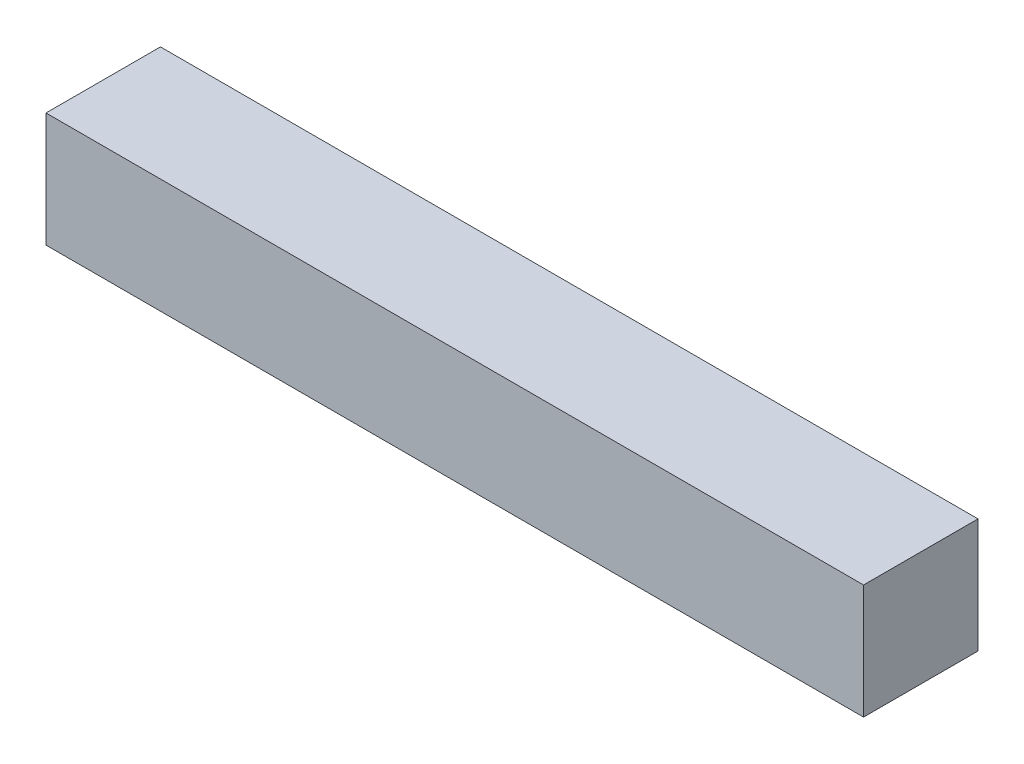
ISO-10303-21;
HEADER;
FILE_DESCRIPTION(('STEP AP214'),'2;1');
FILE_NAME('part.step','',(''),(''),'','','');
FILE_SCHEMA(('AUTOMOTIVE_DESIGN { 1 0 10303 214 1 1 1 1 }'));
ENDSEC;
DATA;
#1=APPLICATION_CONTEXT('core data for automotive mechanical design processes');
#2=APPLICATION_PROTOCOL_DEFINITION('international standard','automotive_design',2000,#1);
#3=PRODUCT_CONTEXT('',#1,'mechanical');
#4=PRODUCT('Part','Part','',(#3));
#5=PRODUCT_RELATED_PRODUCT_CATEGORY('part','',(#4));
#6=PRODUCT_DEFINITION_FORMATION('','',#4);
#7=PRODUCT_DEFINITION_CONTEXT('part definition',#1,'design');
#8=PRODUCT_DEFINITION('design','',#6,#7);
#9=PRODUCT_DEFINITION_SHAPE('','',#8);
#10=(LENGTH_UNIT() NAMED_UNIT(*) SI_UNIT(.MILLI.,.METRE.));
#11=(NAMED_UNIT(*) PLANE_ANGLE_UNIT() SI_UNIT($,.RADIAN.));
#12=(NAMED_UNIT(*) SI_UNIT($,.STERADIAN.) SOLID_ANGLE_UNIT());
#13=UNCERTAINTY_MEASURE_WITH_UNIT(LENGTH_MEASURE(1.E-05),#10,'distance_accuracy_value','');
#14=(GEOMETRIC_REPRESENTATION_CONTEXT(3) GLOBAL_UNCERTAINTY_ASSIGNED_CONTEXT((#13)) GLOBAL_UNIT_ASSIGNED_CONTEXT((#10,
#11,#12)) REPRESENTATION_CONTEXT('',''));
#15=CARTESIAN_POINT('',(0.,0.,0.));
#16=DIRECTION('',(0.,0.,1.));
#17=DIRECTION('',(1.,0.,0.));
#18=AXIS2_PLACEMENT_3D('',#15,#16,#17);
#19=CARTESIAN_POINT('',(-15000.,7000.,7000.));
#20=DIRECTION('',(1.,0.,0.));
#21=DIRECTION('',(0.,0.,-1.));
#22=AXIS2_PLACEMENT_3D('',#19,#20,#21);
#23=PLANE('',#22);
#24=DIRECTION('',(0.,-1.,0.));
#25=VECTOR('',#24,1.);
#26=CARTESIAN_POINT('',(-15000.,7000.,0.));
#27=LINE('',#26,#25);
#28=CARTESIAN_POINT('',(-15000.,7000.,0.));
#29=VERTEX_POINT('',#28);
#30=CARTESIAN_POINT('',(-15000.,0.,0.));
#31=VERTEX_POINT('',#30);
#32=EDGE_CURVE('E289',#29,#31,#27,.T.);
#33=ORIENTED_EDGE('',*,*,#32,.T.);
#34=DIRECTION('',(0.,0.,-1.));
#35=VECTOR('',#34,1.);
#36=CARTESIAN_POINT('',(-15000.,0.,7000.));
#37=LINE('',#36,#35);
#38=CARTESIAN_POINT('',(-15000.,0.,7000.));
#39=VERTEX_POINT('',#38);
#40=EDGE_CURVE('E362',#39,#31,#37,.T.);
#41=ORIENTED_EDGE('',*,*,#40,.F.);
#42=DIRECTION('',(0.,-1.,0.));
#43=VECTOR('',#42,1.);
#44=CARTESIAN_POINT('',(-15000.,7000.,7000.));
#45=LINE('',#44,#43);
#46=CARTESIAN_POINT('',(-15000.,7000.,7000.));
#47=VERTEX_POINT('',#46);
#48=EDGE_CURVE('E292',#47,#39,#45,.T.);
#49=ORIENTED_EDGE('',*,*,#48,.F.);
#50=DIRECTION('',(0.,0.,-1.));
#51=VECTOR('',#50,1.);
#52=CARTESIAN_POINT('',(-15000.,7000.,7000.));
#53=LINE('',#52,#51);
#54=EDGE_CURVE('E361',#47,#29,#53,.T.);
#55=ORIENTED_EDGE('',*,*,#54,.T.);
#56=EDGE_LOOP('',(#33,#41,#49,#55));
#57=FACE_BOUND('',#56,.T.);
#58=ADVANCED_FACE('F50',(#57),#23,.F.);
#59=CARTESIAN_POINT('',(-15000.,0.,7000.));
#60=DIRECTION('',(0.,1.,0.));
#61=DIRECTION('',(0.,0.,1.));
#62=AXIS2_PLACEMENT_3D('',#59,#60,#61);
#63=PLANE('',#62);
#64=DIRECTION('',(1.,0.,0.));
#65=VECTOR('',#64,1.);
#66=CARTESIAN_POINT('',(-15000.,0.,0.));
#67=LINE('',#66,#65);
#68=CARTESIAN_POINT('',(35000.,0.,0.));
#69=VERTEX_POINT('',#68);
#70=EDGE_CURVE('E364',#31,#69,#67,.T.);
#71=ORIENTED_EDGE('',*,*,#70,.T.);
#72=DIRECTION('',(0.,0.,-1.));
#73=VECTOR('',#72,1.);
#74=CARTESIAN_POINT('',(35000.,0.,7000.));
#75=LINE('',#74,#73);
#76=CARTESIAN_POINT('',(35000.,0.,7000.));
#77=VERTEX_POINT('',#76);
#78=EDGE_CURVE('E380',#77,#69,#75,.T.);
#79=ORIENTED_EDGE('',*,*,#78,.F.);
#80=DIRECTION('',(1.,0.,0.));
#81=VECTOR('',#80,1.);
#82=CARTESIAN_POINT('',(-15000.,0.,7000.));
#83=LINE('',#82,#81);
#84=EDGE_CURVE('E97',#39,#77,#83,.T.);
#85=ORIENTED_EDGE('',*,*,#84,.F.);
#86=ORIENTED_EDGE('',*,*,#40,.T.);
#87=EDGE_LOOP('',(#71,#79,#85,#86));
#88=FACE_BOUND('',#87,.T.);
#89=ADVANCED_FACE('F355',(#88),#63,.F.);
#90=CARTESIAN_POINT('',(35000.,0.,7000.));
#91=DIRECTION('',(-1.,0.,0.));
#92=DIRECTION('',(0.,0.,1.));
#93=AXIS2_PLACEMENT_3D('',#90,#91,#92);
#94=PLANE('',#93);
#95=DIRECTION('',(0.,1.,0.));
#96=VECTOR('',#95,1.);
#97=CARTESIAN_POINT('',(35000.,0.,0.));
#98=LINE('',#97,#96);
#99=CARTESIAN_POINT('',(35000.,7000.,0.));
#100=VERTEX_POINT('',#99);
#101=EDGE_CURVE('E370',#69,#100,#98,.T.);
#102=ORIENTED_EDGE('',*,*,#101,.T.);
#103=DIRECTION('',(0.,0.,-1.));
#104=VECTOR('',#103,1.);
#105=CARTESIAN_POINT('',(35000.,7000.,7000.));
#106=LINE('',#105,#104);
#107=CARTESIAN_POINT('',(35000.,7000.,7000.));
#108=VERTEX_POINT('',#107);
#109=EDGE_CURVE('E374',#108,#100,#106,.T.);
#110=ORIENTED_EDGE('',*,*,#109,.F.);
#111=DIRECTION('',(0.,1.,0.));
#112=VECTOR('',#111,1.);
#113=CARTESIAN_POINT('',(35000.,0.,7000.));
#114=LINE('',#113,#112);
#115=EDGE_CURVE('E555',#77,#108,#114,.T.);
#116=ORIENTED_EDGE('',*,*,#115,.F.);
#117=ORIENTED_EDGE('',*,*,#78,.T.);
#118=EDGE_LOOP('',(#102,#110,#116,#117));
#119=FACE_BOUND('',#118,.T.);
#120=ADVANCED_FACE('F360',(#119),#94,.F.);
#121=CARTESIAN_POINT('',(35000.,7000.,7000.));
#122=DIRECTION('',(0.,-1.,0.));
#123=DIRECTION('',(0.,0.,-1.));
#124=AXIS2_PLACEMENT_3D('',#121,#122,#123);
#125=PLANE('',#124);
#126=DIRECTION('',(-1.,0.,0.));
#127=VECTOR('',#126,1.);
#128=CARTESIAN_POINT('',(35000.,7000.,0.));
#129=LINE('',#128,#127);
#130=EDGE_CURVE('E93',#100,#29,#129,.T.);
#131=ORIENTED_EDGE('',*,*,#130,.T.);
#132=ORIENTED_EDGE('',*,*,#54,.F.);
#133=DIRECTION('',(-1.,0.,0.));
#134=VECTOR('',#133,1.);
#135=CARTESIAN_POINT('',(35000.,7000.,7000.));
#136=LINE('',#135,#134);
#137=EDGE_CURVE('E69',#108,#47,#136,.T.);
#138=ORIENTED_EDGE('',*,*,#137,.F.);
#139=ORIENTED_EDGE('',*,*,#109,.T.);
#140=EDGE_LOOP('',(#131,#132,#138,#139));
#141=FACE_BOUND('',#140,.T.);
#142=ADVANCED_FACE('F518',(#141),#125,.F.);
#143=CARTESIAN_POINT('',(0.,0.,7000.));
#144=DIRECTION('',(0.,0.,1.));
#145=DIRECTION('',(1.,0.,0.));
#146=AXIS2_PLACEMENT_3D('',#143,#144,#145);
#147=PLANE('',#146);
#148=ORIENTED_EDGE('',*,*,#48,.T.);
#149=ORIENTED_EDGE('',*,*,#84,.T.);
#150=ORIENTED_EDGE('',*,*,#115,.T.);
#151=ORIENTED_EDGE('',*,*,#137,.T.);
#152=EDGE_LOOP('',(#148,#149,#150,#151));
#153=FACE_BOUND('',#152,.T.);
#154=ADVANCED_FACE('F506',(#153),#147,.T.);
#155=CARTESIAN_POINT('',(0.,0.,0.));
#156=DIRECTION('',(0.,0.,1.));
#157=DIRECTION('',(1.,0.,0.));
#158=AXIS2_PLACEMENT_3D('',#155,#156,#157);
#159=PLANE('',#158);
#160=CARTESIAN_POINT('',(2596.6885254335,3150.,0.));
#161=DIRECTION('',(0.,0.,1.));
#162=DIRECTION('',(1.,0.,0.));
#163=AXIS2_PLACEMENT_3D('',#160,#161,#162);
#164=CIRCLE('',#163,3000.);
#165=CARTESIAN_POINT('',(2596.68852543349,150.,0.));
#166=VERTEX_POINT('',#165);
#167=CARTESIAN_POINT('',(2805.95827763562,157.307872364204,0.));
#168=VERTEX_POINT('',#167);
#169=EDGE_CURVE('E397',#166,#168,#164,.T.);
#170=ORIENTED_EDGE('',*,*,#169,.T.);
#171=DIRECTION('',(0.997564042545266,0.0697565840673672,0.));
#172=VECTOR('',#171,1.);
#173=CARTESIAN_POINT('',(2.70721029502106,-38.7148493870236,0.));
#174=LINE('',#173,#172);
#175=CARTESIAN_POINT('',(4781.451,295.448,0.));
#176=VERTEX_POINT('',#175);
#177=EDGE_CURVE('E11',#168,#176,#174,.T.);
#178=ORIENTED_EDGE('',*,*,#177,.T.);
#179=DIRECTION('',(0.,-1.,0.));
#180=VECTOR('',#179,1.);
#181=CARTESIAN_POINT('',(4781.451,0.,0.));
#182=LINE('',#181,#180);
#183=CARTESIAN_POINT('',(4781.451,507.675,0.));
#184=VERTEX_POINT('',#183);
#185=EDGE_CURVE('E53',#184,#176,#182,.T.);
#186=ORIENTED_EDGE('',*,*,#185,.F.);
#187=DIRECTION('',(-0.990268064554139,0.139173130755187,0.));
#188=VECTOR('',#187,1.);
#189=CARTESIAN_POINT('',(162.579802991674,1156.81515512762,0.));
#190=LINE('',#189,#188);
#191=CARTESIAN_POINT('',(2839.9436073883,780.536129108276,0.));
#192=VERTEX_POINT('',#191);
#193=EDGE_CURVE('E404',#184,#192,#190,.T.);
#194=ORIENTED_EDGE('',*,*,#193,.T.);
#195=CARTESIAN_POINT('',(2561.59734587792,-1200.,0.));
#196=DIRECTION('',(0.,0.,1.));
#197=DIRECTION('',(1.,0.,0.));
#198=AXIS2_PLACEMENT_3D('',#195,#196,#197);
#199=CIRCLE('',#198,2000.);
#200=CARTESIAN_POINT('',(2561.59734587791,800.,0.));
#201=VERTEX_POINT('',#200);
#202=EDGE_CURVE('E405',#192,#201,#199,.T.);
#203=ORIENTED_EDGE('',*,*,#202,.T.);
#204=DIRECTION('',(1.,0.,0.));
#205=VECTOR('',#204,1.);
#206=CARTESIAN_POINT('',(0.,800.,0.));
#207=LINE('',#206,#205);
#208=CARTESIAN_POINT('',(1524.43296743589,800.,0.));
#209=VERTEX_POINT('',#208);
#210=EDGE_CURVE('E215',#209,#201,#207,.T.);
#211=ORIENTED_EDGE('',*,*,#210,.F.);
#212=CARTESIAN_POINT('',(1524.43296743588,-200.,0.));
#213=DIRECTION('',(0.,0.,1.));
#214=DIRECTION('',(1.,0.,0.));
#215=AXIS2_PLACEMENT_3D('',#212,#213,#214);
#216=CIRCLE('',#215,1000.);
#217=CARTESIAN_POINT('',(1282.13370336686,770.201559796526,0.));
#218=VERTEX_POINT('',#217);
#219=EDGE_CURVE('E381',#209,#218,#216,.T.);
#220=ORIENTED_EDGE('',*,*,#219,.T.);
#221=DIRECTION('',(-0.970201559796527,-0.242299264069014,0.));
#222=VECTOR('',#221,1.);
#223=CARTESIAN_POINT('',(-105.785605771789,423.580979984227,0.));
#224=LINE('',#223,#222);
#225=CARTESIAN_POINT('',(113.655110389649,478.384359236518,0.));
#226=VERTEX_POINT('',#225);
#227=EDGE_CURVE('E383',#218,#226,#224,.T.);
#228=ORIENTED_EDGE('',*,*,#227,.T.);
#229=CARTESIAN_POINT('',(150.,332.854125267039,0.));
#230=DIRECTION('',(0.,0.,1.));
#231=DIRECTION('',(1.,0.,0.));
#232=AXIS2_PLACEMENT_3D('',#229,#230,#231);
#233=CIRCLE('',#232,150.);
#234=CARTESIAN_POINT('',(88.915850741552,469.853127852355,0.));
#235=VERTEX_POINT('',#234);
#236=EDGE_CURVE('E390',#226,#235,#233,.T.);
#237=ORIENTED_EDGE('',*,*,#236,.T.);
#238=DIRECTION('',(0.,-1.,0.));
#239=VECTOR('',#238,1.);
#240=CARTESIAN_POINT('',(88.915850741552,800.,0.));
#241=LINE('',#240,#239);
#242=CARTESIAN_POINT('',(88.915850741552,163.000997414683,0.));
#243=VERTEX_POINT('',#242);
#244=EDGE_CURVE('E392',#243,#235,#241,.F.);
#245=ORIENTED_EDGE('',*,*,#244,.F.);
#246=CARTESIAN_POINT('',(150.,300.,0.));
#247=DIRECTION('',(0.,0.,1.));
#248=DIRECTION('',(1.,0.,0.));
#249=AXIS2_PLACEMENT_3D('',#246,#247,#248);
#250=CIRCLE('',#249,150.);
#251=CARTESIAN_POINT('',(150.,150.,0.));
#252=VERTEX_POINT('',#251);
#253=EDGE_CURVE('E394',#243,#252,#250,.T.);
#254=ORIENTED_EDGE('',*,*,#253,.T.);
#255=DIRECTION('',(1.,0.,0.));
#256=VECTOR('',#255,1.);
#257=CARTESIAN_POINT('',(0.,150.,0.));
#258=LINE('',#257,#256);
#259=EDGE_CURVE('E398',#252,#166,#258,.T.);
#260=ORIENTED_EDGE('',*,*,#259,.T.);
#261=EDGE_LOOP('',(#170,#178,#186,#194,#203,#211,#220,#228,#237,#245,#254,#260));
#262=FACE_BOUND('',#261,.T.);
#263=ORIENTED_EDGE('',*,*,#32,.F.);
#264=ORIENTED_EDGE('',*,*,#130,.F.);
#265=ORIENTED_EDGE('',*,*,#101,.F.);
#266=ORIENTED_EDGE('',*,*,#70,.F.);
#267=EDGE_LOOP('',(#263,#264,#265,#266));
#268=FACE_BOUND('',#267,.T.);
#269=ADVANCED_FACE('F425',(#262,#268),#159,.F.);
#270=CARTESIAN_POINT('',(4781.451,800.,-433.24));
#271=DIRECTION('',(-1.,0.,0.));
#272=DIRECTION('',(0.,0.,1.));
#273=AXIS2_PLACEMENT_3D('',#270,#271,#272);
#274=PLANE('',#273);
#275=ORIENTED_EDGE('',*,*,#185,.T.);
#276=DIRECTION('',(0.,0.,1.));
#277=VECTOR('',#276,1.);
#278=CARTESIAN_POINT('',(4781.451,295.448,-800.));
#279=LINE('',#278,#277);
#280=CARTESIAN_POINT('',(4781.451,295.448,433.24));
#281=VERTEX_POINT('',#280);
#282=EDGE_CURVE('E415',#176,#281,#279,.T.);
#283=ORIENTED_EDGE('',*,*,#282,.T.);
#284=DIRECTION('',(0.,-1.,0.));
#285=VECTOR('',#284,1.);
#286=CARTESIAN_POINT('',(4781.451,800.,433.24));
#287=LINE('',#286,#285);
#288=CARTESIAN_POINT('',(4781.451,507.675,433.24));
#289=VERTEX_POINT('',#288);
#290=EDGE_CURVE('E235',#289,#281,#287,.T.);
#291=ORIENTED_EDGE('',*,*,#290,.F.);
#292=DIRECTION('',(0.,0.,1.));
#293=VECTOR('',#292,1.);
#294=CARTESIAN_POINT('',(4781.451,507.675,-800.));
#295=LINE('',#294,#293);
#296=EDGE_CURVE('E412',#184,#289,#295,.T.);
#297=ORIENTED_EDGE('',*,*,#296,.F.);
#298=EDGE_LOOP('',(#275,#283,#291,#297));
#299=FACE_BOUND('',#298,.T.);
#300=ADVANCED_FACE('F408',(#299),#274,.T.);
#301=CARTESIAN_POINT('',(248.915850741552,800.,0.));
#302=DIRECTION('',(0.,-1.,0.));
#303=DIRECTION('',(0.,0.,-1.));
#304=AXIS2_PLACEMENT_3D('',#301,#302,#303);
#305=CYLINDRICAL_SURFACE('',#304,160.);
#306=ORIENTED_EDGE('',*,*,#244,.T.);
#307=CARTESIAN_POINT('',(113.655110389649,478.384359236518,-85.4665555609618));
#308=CARTESIAN_POINT('',(112.481548775141,478.091251246447,-83.6092670561845));
#309=CARTESIAN_POINT('',(111.346644097831,477.792758019416,-81.7284269553966));
#310=CARTESIAN_POINT('',(109.155539322376,477.190616158341,-77.9222492442464));
#311=CARTESIAN_POINT('',(108.099339287709,476.886967520139,-75.9969115979976));
#312=CARTESIAN_POINT('',(106.066726798449,476.28003794887,-72.1037544888214));
#313=CARTESIAN_POINT('',(105.090338751608,475.976757156024,-70.1359222612503));
#314=CARTESIAN_POINT('',(103.219078804833,475.376092646382,-66.1609856636512));
#315=CARTESIAN_POINT('',(102.324206889226,475.078708928454,-64.1538813011744));
#316=CARTESIAN_POINT('',(100.615155376205,474.494355571979,-60.0979126598209));
#317=CARTESIAN_POINT('',(99.8011893520995,474.207414701507,-58.0489542101899));
#318=CARTESIAN_POINT('',(98.2579649310513,473.649846063953,-53.9172011460308));
#319=CARTESIAN_POINT('',(97.5287058529187,473.379218165696,-51.8344068037553));
#320=CARTESIAN_POINT('',(96.1563301521992,472.859117084361,-47.6382320407094));
#321=CARTESIAN_POINT('',(95.5132051875328,472.60964185351,-45.5248546039078));
#322=CARTESIAN_POINT('',(94.3143584712709,472.136301959897,-41.2706008249891));
#323=CARTESIAN_POINT('',(93.7586366886521,471.912437288045,-39.129724492633));
#324=CARTESIAN_POINT('',(92.734201058544,471.493714068683,-34.8169588640611));
#325=CARTESIAN_POINT('',(92.2657777763377,471.298952800951,-32.6449910275406));
#326=CARTESIAN_POINT('',(91.4193769647117,470.942942652504,-28.2807602607468));
#327=CARTESIAN_POINT('',(91.0413994536701,470.781693778598,-26.0884973263497));
#328=CARTESIAN_POINT('',(90.3769099830872,470.495754350508,-21.6877031685099));
#329=CARTESIAN_POINT('',(90.0904006314539,470.3710648387,-19.4791714830548));
#330=CARTESIAN_POINT('',(89.6096920384309,470.160642293218,-15.0502286552799));
#331=CARTESIAN_POINT('',(89.4154925954417,470.074909174466,-12.8298175389147));
#332=CARTESIAN_POINT('',(89.1202871703629,469.944192772485,-8.38608203623215));
#333=CARTESIAN_POINT('',(89.0190950709365,469.89912811075,-6.16277242290111));
#334=CARTESIAN_POINT('',(88.9095494355952,469.85033130989,-1.7134028572591));
#335=CARTESIAN_POINT('',(88.9011961796687,469.84659929542,0.512657103326271));
#336=CARTESIAN_POINT('',(88.9773519842946,469.88053927644,4.96271330927351));
#337=CARTESIAN_POINT('',(89.0618546528502,469.918208421966,7.18670968614089));
#338=CARTESIAN_POINT('',(89.3234496791945,470.03421396927,11.6281606883902));
#339=CARTESIAN_POINT('',(89.5005408160219,470.112549834776,13.8456153996491));
#340=CARTESIAN_POINT('',(89.9321621045493,470.301956853117,18.1246654421955));
#341=CARTESIAN_POINT('',(90.180864494467,470.410549583801,20.1869618215955));
#342=CARTESIAN_POINT('',(90.7580231251843,470.660101286196,24.2983674646402));
#343=CARTESIAN_POINT('',(91.0864784483613,470.80105988551,26.3474768797332));
#344=CARTESIAN_POINT('',(91.8223683487925,471.113023031167,30.4292401482985));
#345=CARTESIAN_POINT('',(92.2298065529467,471.284028957252,32.4618932416281));
#346=CARTESIAN_POINT('',(93.1227318674805,471.653295725565,36.5074669964445));
#347=CARTESIAN_POINT('',(93.6082188789857,471.851556533266,38.5203876829254));
#348=CARTESIAN_POINT('',(94.6565718524244,472.272288049974,42.5248328398245));
#349=CARTESIAN_POINT('',(95.2194884903989,472.494774594172,44.5163423691311));
#350=CARTESIAN_POINT('',(96.4213890293698,472.960326816393,48.4738685170571));
#351=CARTESIAN_POINT('',(97.0603744864908,473.203392915377,50.4398846132499));
#352=CARTESIAN_POINT('',(98.4131156544516,473.706224503163,54.3432821371033));
#353=CARTESIAN_POINT('',(99.1268525408052,473.965985781319,56.2806706344256));
#354=CARTESIAN_POINT('',(100.628038160787,474.498198486723,60.1247195944822));
#355=CARTESIAN_POINT('',(101.415481149761,474.770648924148,62.0313824384198));
#356=CARTESIAN_POINT('',(103.053431404472,475.32081390248,65.789878090736));
#357=CARTESIAN_POINT('',(103.903101089785,475.598430707961,67.6420903769369));
#358=CARTESIAN_POINT('',(105.67209476984,476.157638898924,71.3118119286049));
#359=CARTESIAN_POINT('',(106.591403065114,476.439229376993,73.1293289008586));
#360=CARTESIAN_POINT('',(108.495734917951,477.001198489011,76.7223038998116));
#361=CARTESIAN_POINT('',(109.480541740212,477.281578141369,78.4978766389943));
#362=CARTESIAN_POINT('',(111.517572665777,477.837629462675,82.0112043076934));
#363=CARTESIAN_POINT('',(112.569811610849,478.11330007814,83.7489507981427));
#364=CARTESIAN_POINT('',(113.655110389649,478.384359236518,85.4665555609618));
#365=B_SPLINE_CURVE_WITH_KNOTS('',3,(#307,#308,#309,#310,#311,#312,#313,#314,#315,#316,#317,
#318,#319,#320,#321,#322,#323,#324,#325,#326,#327,#328,#329,#330,#331,#332,#333,#334,#335,#336,
#337,#338,#339,#340,#341,#342,#343,#344,#345,#346,#347,#348,#349,#350,#351,#352,#353,#354,#355,
#356,#357,#358,#359,#360,#361,#362,#363,#364),.UNSPECIFIED.,.F.,.F.,(4,2,2,2,2,2,2,2,2,2,2,2,2,
2,2,2,2,2,2,2,2,2,2,2,2,2,2,2,4),(0.,6.64887428778499,13.2977539379704,19.948659370851,
26.5995635249058,33.2675826096337,39.9355480683043,46.602867267515,53.2701841001858,
59.9593109336103,66.6484391262357,73.3377580199061,80.0270623044362,86.7029512669012,
93.3788603628692,100.054309932788,106.729671475984,112.96807935669,119.206415462809,
125.445038101686,131.683652837372,137.926370215055,144.169215320706,150.41049206757,
156.651282773596,162.819674438677,168.986679604275,175.134206067186,181.283090275135),.UNSPECIFIED.);
#366=CARTESIAN_POINT('',(113.655110389649,478.384359236518,85.4665555609617));
#367=VERTEX_POINT('',#366);
#368=EDGE_CURVE('E284',#235,#367,#365,.T.);
#369=ORIENTED_EDGE('',*,*,#368,.T.);
#370=CARTESIAN_POINT('',(248.915850741552,512.164533586649,0.));
#371=DIRECTION('',(-0.242299264069014,0.970201559796527,0.));
#372=DIRECTION('',(-0.970201559796527,-0.242299264069014,0.));
#373=AXIS2_PLACEMENT_3D('',#370,#371,#372);
#374=ELLIPSE('',#373,164.914185495182,160.);
#375=CARTESIAN_POINT('',(146.069849075792,486.479653713564,122.567124227366));
#376=VERTEX_POINT('',#375);
#377=EDGE_CURVE('E239',#367,#376,#374,.T.);
#378=ORIENTED_EDGE('',*,*,#377,.T.);
#379=DIRECTION('',(0.,-1.,0.));
#380=VECTOR('',#379,1.);
#381=CARTESIAN_POINT('',(146.069849075792,800.,122.567124227366));
#382=LINE('',#381,#380);
#383=CARTESIAN_POINT('',(146.069849075792,150.05149579368,122.567124227366));
#384=VERTEX_POINT('',#383);
#385=EDGE_CURVE('E264',#376,#384,#382,.T.);
#386=ORIENTED_EDGE('',*,*,#385,.T.);
#387=CARTESIAN_POINT('',(146.069849075792,150.05149579368,122.567124227366));
#388=CARTESIAN_POINT('',(145.225896187737,150.073615862986,121.858965274647));
#389=CARTESIAN_POINT('',(144.389403735078,150.10267037739,121.142208725448));
#390=CARTESIAN_POINT('',(142.731732562761,150.173898990735,119.691878810571));
#391=CARTESIAN_POINT('',(141.910553439385,150.216072743283,118.958305889376));
#392=CARTESIAN_POINT('',(139.470868366272,150.361129926342,116.733201024686));
#393=CARTESIAN_POINT('',(137.875841570126,150.482559716361,115.21696983069));
#394=CARTESIAN_POINT('',(134.753163894521,150.768668470949,112.123624232258));
#395=CARTESIAN_POINT('',(133.225451311803,150.93330682306,110.546568179288));
#396=CARTESIAN_POINT('',(130.238183443832,151.299848120688,107.333236526025));
#397=CARTESIAN_POINT('',(128.778630993244,151.501752614314,105.696958467806));
#398=CARTESIAN_POINT('',(125.931676935866,151.936544202405,102.370309508307));
#399=CARTESIAN_POINT('',(124.544189466091,152.169393192373,100.680007045348));
#400=CARTESIAN_POINT('',(121.841191805207,152.660363289409,97.2461106147451));
#401=CARTESIAN_POINT('',(120.525688743644,152.918486892713,95.5025113949941));
#402=CARTESIAN_POINT('',(117.968237374469,153.454193404723,91.964601104587));
#403=CARTESIAN_POINT('',(116.726302922445,153.731779957634,90.170280574709));
#404=CARTESIAN_POINT('',(114.317781697973,154.30061613028,86.5339001588783));
#405=CARTESIAN_POINT('',(113.151194562145,154.591865684108,84.6918405032186));
#406=CARTESIAN_POINT('',(110.897824733608,155.181587391354,80.9675780900093));
#407=CARTESIAN_POINT('',(109.810835528921,155.480037975042,79.0854968370817));
#408=CARTESIAN_POINT('',(107.714650290854,156.079405738675,75.2790893235231));
#409=CARTESIAN_POINT('',(106.705447961739,156.380322716814,73.3547664979749));
#410=CARTESIAN_POINT('',(104.766102256039,156.979286585441,69.4663235668635));
#411=CARTESIAN_POINT('',(103.835956381895,157.277333566333,67.5022047209694));
#412=CARTESIAN_POINT('',(102.056014725659,157.865370760941,63.5366972442528));
#413=CARTESIAN_POINT('',(101.206218978074,158.155360971196,61.5353085974242));
#414=CARTESIAN_POINT('',(99.5883438109571,158.722260492992,57.4980406642496));
#415=CARTESIAN_POINT('',(98.8202607704063,158.999170383872,55.4621629108929));
#416=CARTESIAN_POINT('',(97.3670981874398,159.535137994833,51.3586713046533));
#417=CARTESIAN_POINT('',(96.6820184537681,159.794195756048,49.2910575249088));
#418=CARTESIAN_POINT('',(95.3961544075052,160.289961127426,45.1270537425637));
#419=CARTESIAN_POINT('',(94.7953724399696,160.526668115759,43.0306629412036));
#420=CARTESIAN_POINT('',(93.6793946591402,160.973560921307,38.8124012031521));
#421=CARTESIAN_POINT('',(93.1641993485658,161.183746582739,36.6905301168728));
#422=CARTESIAN_POINT('',(92.2054815596859,161.580090147205,32.356487055965));
#423=CARTESIAN_POINT('',(91.7647823485292,161.765263152301,30.1435991960532));
#424=CARTESIAN_POINT('',(90.9769971450889,162.099788455264,25.6985091153241));
#425=CARTESIAN_POINT('',(90.6299116592006,162.249140559359,23.4663067900942));
#426=CARTESIAN_POINT('',(90.0303510649592,162.509098243442,18.9869432101127));
#427=CARTESIAN_POINT('',(89.777877113808,162.61970334951,16.739781772737));
#428=CARTESIAN_POINT('',(89.3683152411961,162.799967461146,12.2351431066173));
#429=CARTESIAN_POINT('',(89.2112269898517,162.869626608322,9.97766591357682));
#430=CARTESIAN_POINT('',(88.9929975399224,162.966573670469,5.45852462440302));
#431=CARTESIAN_POINT('',(88.931798748024,162.993887019151,3.1968638589837));
#432=CARTESIAN_POINT('',(88.9053650594043,163.005672372788,-1.32714256143511));
#433=CARTESIAN_POINT('',(88.9401306105545,162.990144177799,-3.58948821958177));
#434=CARTESIAN_POINT('',(89.1055089639775,162.916561534982,-8.10985402745365));
#435=CARTESIAN_POINT('',(89.2361168008861,162.858509290226,-10.3678743951861));
#436=CARTESIAN_POINT('',(89.5927585147658,162.701044450916,-14.87488490689));
#437=CARTESIAN_POINT('',(89.8187908128023,162.601632540717,-17.1238751996554));
#438=CARTESIAN_POINT('',(90.3429801812063,162.37327852936,-21.4228503778689));
#439=CARTESIAN_POINT('',(90.6336330597826,162.247455783682,-23.4739216594459));
#440=CARTESIAN_POINT('',(91.2939301473005,161.964764084953,-27.561119440647));
#441=CARTESIAN_POINT('',(91.6635730265225,161.80789565453,-29.597246191251));
#442=CARTESIAN_POINT('',(92.4809730975262,161.465680222719,-33.6512206894353));
#443=CARTESIAN_POINT('',(92.9287263920883,161.280334642216,-35.6690693436968));
#444=CARTESIAN_POINT('',(93.9013954038357,160.884140870222,-39.6835512615572));
#445=CARTESIAN_POINT('',(94.4263115671196,160.673292531293,-41.680184402432));
#446=CARTESIAN_POINT('',(95.552956526948,160.229164392324,-45.6518215466958));
#447=CARTESIAN_POINT('',(96.1547795676428,159.995857158458,-47.6267957290531));
#448=CARTESIAN_POINT('',(97.433630910992,159.51069618808,-51.5499146356778));
#449=CARTESIAN_POINT('',(98.1106590220711,159.258842498813,-53.4980594282756));
#450=CARTESIAN_POINT('',(99.538782262935,158.74051365247,-57.3649671512542));
#451=CARTESIAN_POINT('',(100.289875495452,158.474038870009,-59.2837308328139));
#452=CARTESIAN_POINT('',(101.865082458927,157.930566690855,-63.0897276306053));
#453=CARTESIAN_POINT('',(102.689202935477,157.653568323443,-64.9769578148825));
#454=CARTESIAN_POINT('',(104.456303458341,157.078057225516,-68.819711214547));
#455=CARTESIAN_POINT('',(105.403318300004,156.779196163741,-70.7733280095368));
#456=CARTESIAN_POINT('',(107.376037897786,156.179762703235,-74.6404280365021));
#457=CARTESIAN_POINT('',(108.401751633397,155.879190112854,-76.5539066569258));
#458=CARTESIAN_POINT('',(110.530581696098,155.281696502486,-80.3382296775498));
#459=CARTESIAN_POINT('',(111.633707914142,154.984775954837,-82.2090685890931));
#460=CARTESIAN_POINT('',(113.915877050779,154.400125158147,-85.9053240855944));
#461=CARTESIAN_POINT('',(115.094919561143,154.112394859699,-87.7307409147313));
#462=CARTESIAN_POINT('',(117.524840972472,153.55234668348,-91.3296578351682));
#463=CARTESIAN_POINT('',(118.775557206226,153.279996489343,-93.1032626927824));
#464=CARTESIAN_POINT('',(121.349511124312,152.755732624533,-96.599903409527));
#465=CARTESIAN_POINT('',(122.672741392116,152.503816870396,-98.3229444126078));
#466=CARTESIAN_POINT('',(125.389551045749,152.026261589838,-101.715157723088));
#467=CARTESIAN_POINT('',(126.783099172462,151.800610532677,-103.384353435242));
#468=CARTESIAN_POINT('',(129.639032745831,151.381314860076,-106.666639713441));
#469=CARTESIAN_POINT('',(131.101408518524,151.187665763808,-108.279738109067));
#470=CARTESIAN_POINT('',(133.655821740112,150.889289293303,-110.984248112761));
#471=CARTESIAN_POINT('',(134.731225491401,150.775112297827,-112.090379610977));
#472=CARTESIAN_POINT('',(136.914396270225,150.567844867437,-114.271846346382));
#473=CARTESIAN_POINT('',(138.022156519602,150.474750051413,-115.347187941403));
#474=CARTESIAN_POINT('',(140.268778276439,150.311753447705,-117.465723562963));
#475=CARTESIAN_POINT('',(141.407626285841,150.241841762145,-118.508931135887));
#476=CARTESIAN_POINT('',(143.716040656992,150.127227399585,-120.562798775275));
#477=CARTESIAN_POINT('',(144.885614606153,150.082531011623,-121.573450662694));
#478=CARTESIAN_POINT('',(146.069849075792,150.05149579368,-122.567124227366));
#479=B_SPLINE_CURVE_WITH_KNOTS('',3,(#387,#388,#389,#390,#391,#392,#393,#394,#395,#396,#397,
#398,#399,#400,#401,#402,#403,#404,#405,#406,#407,#408,#409,#410,#411,#412,#413,#414,#415,#416,
#417,#418,#419,#420,#421,#422,#423,#424,#425,#426,#427,#428,#429,#430,#431,#432,#433,#434,#435,
#436,#437,#438,#439,#440,#441,#442,#443,#444,#445,#446,#447,#448,#449,#450,#451,#452,#453,#454,
#455,#456,#457,#458,#459,#460,#461,#462,#463,#464,#465,#466,#467,#468,#469,#470,#471,#472,#473,
#474,#475,#476,#477,#478),.UNSPECIFIED.,.F.,.F.,(4,2,2,2,2,2,2,2,2,2,2,2,2,2,2,2,2,2,2,2,2,2,2,
2,2,2,2,2,2,2,2,2,2,2,2,2,2,2,2,2,2,2,2,2,2,4),(0.,3.30559604593699,6.61110482002071,
13.2206621164552,19.8240290900284,26.4276704422381,33.0232542588257,39.6194901433589,
46.216964409734,52.8144068558634,59.3940770956331,65.9732142446666,72.5521434676604,
79.1310755161271,85.7097159041363,92.2883411333659,98.867149335237,105.445996178394,
112.235502939955,119.025046428025,125.814672956883,132.604276004225,139.389799501632,
146.175354667559,152.960558314591,159.745649695085,165.970012292596,172.194270117275,
178.418217479313,184.642200825034,190.873885721807,197.105554744543,203.337064177007,
209.56914982083,216.141917856387,222.715436958894,229.289797491092,235.864122673364,
242.424076492287,248.983360625576,255.539754149569,262.095228885801,266.73536063561,
271.374527228182,276.011710603077,280.650050043955),.UNSPECIFIED.);
#480=EDGE_CURVE('E231',#384,#243,#479,.T.);
#481=ORIENTED_EDGE('',*,*,#480,.T.);
#482=EDGE_LOOP('',(#306,#369,#378,#386,#481));
#483=FACE_BOUND('',#482,.T.);
#484=ADVANCED_FACE('F291',(#483),#305,.F.);
#485=CARTESIAN_POINT('',(2631.46009170789,800.,0.));
#486=DIRECTION('',(0.,-1.,0.));
#487=DIRECTION('',(0.,0.,-1.));
#488=AXIS2_PLACEMENT_3D('',#485,#486,#487);
#489=PLANE('',#488);
#490=ORIENTED_EDGE('',*,*,#210,.T.);
#491=DIRECTION('',(0.,0.,1.));
#492=VECTOR('',#491,1.);
#493=CARTESIAN_POINT('',(2561.59734587791,800.,-800.));
#494=LINE('',#493,#492);
#495=CARTESIAN_POINT('',(2561.59734587791,800.,800.));
#496=VERTEX_POINT('',#495);
#497=EDGE_CURVE('E202',#201,#496,#494,.T.);
#498=ORIENTED_EDGE('',*,*,#497,.T.);
#499=DIRECTION('',(1.,0.,0.));
#500=VECTOR('',#499,1.);
#501=CARTESIAN_POINT('',(2631.46009170789,800.,800.));
#502=LINE('',#501,#500);
#503=CARTESIAN_POINT('',(1524.43296743589,800.,800.));
#504=VERTEX_POINT('',#503);
#505=EDGE_CURVE('E209',#504,#496,#502,.T.);
#506=ORIENTED_EDGE('',*,*,#505,.F.);
#507=DIRECTION('',(0.,0.,1.));
#508=VECTOR('',#507,1.);
#509=CARTESIAN_POINT('',(1524.43296743589,800.,-800.));
#510=LINE('',#509,#508);
#511=EDGE_CURVE('E214',#209,#504,#510,.T.);
#512=ORIENTED_EDGE('',*,*,#511,.F.);
#513=EDGE_LOOP('',(#490,#498,#506,#512));
#514=FACE_BOUND('',#513,.T.);
#515=ADVANCED_FACE('F210',(#514),#489,.T.);
#516=CARTESIAN_POINT('',(2839.9436073883,780.536129108276,-800.));
#517=DIRECTION('',(0.139173130755187,0.990268064554139,0.));
#518=DIRECTION('',(-0.990268064554139,0.139173130755187,0.));
#519=AXIS2_PLACEMENT_3D('',#516,#517,#518);
#520=PLANE('',#519);
#521=ORIENTED_EDGE('',*,*,#296,.T.);
#522=DIRECTION('',(0.975508592272086,-0.137098821748047,-0.172008428510438));
#523=VECTOR('',#522,1.);
#524=CARTESIAN_POINT('',(4742.35513919662,513.169566110264,440.133652840504));
#525=LINE('',#524,#523);
#526=CARTESIAN_POINT('',(2839.9436073883,780.536129108276,775.58002467032));
#527=VERTEX_POINT('',#526);
#528=EDGE_CURVE('E268',#527,#289,#525,.T.);
#529=ORIENTED_EDGE('',*,*,#528,.F.);
#530=DIRECTION('',(0.,0.,1.));
#531=VECTOR('',#530,1.);
#532=CARTESIAN_POINT('',(2839.9436073883,780.536129108276,-800.));
#533=LINE('',#532,#531);
#534=EDGE_CURVE('E216',#192,#527,#533,.T.);
#535=ORIENTED_EDGE('',*,*,#534,.F.);
#536=ORIENTED_EDGE('',*,*,#193,.F.);
#537=EDGE_LOOP('',(#521,#529,#535,#536));
#538=FACE_BOUND('',#537,.T.);
#539=ADVANCED_FACE('F484',(#538),#520,.F.);
#540=CARTESIAN_POINT('',(2561.59734587792,-1200.,-800.));
#541=DIRECTION('',(0.,0.,1.));
#542=DIRECTION('',(1.,0.,0.));
#543=AXIS2_PLACEMENT_3D('',#540,#541,#542);
#544=CYLINDRICAL_SURFACE('',#543,2000.);
#545=ORIENTED_EDGE('',*,*,#534,.T.);
#546=CARTESIAN_POINT('',(2561.59734587792,-1200.,824.659964512411));
#547=DIRECTION('',(-0.173648122622343,0.,-0.984807762718052));
#548=DIRECTION('',(-0.984807762718053,0.,0.173648122622343));
#549=AXIS2_PLACEMENT_3D('',#546,#547,#548);
#550=ELLIPSE('',#549,2030.85320375627,2000.);
#551=CARTESIAN_POINT('',(2770.37858980576,789.072746830529,787.846210174442));
#552=VERTEX_POINT('',#551);
#553=EDGE_CURVE('E420',#552,#527,#550,.T.);
#554=ORIENTED_EDGE('',*,*,#553,.F.);
#555=CARTESIAN_POINT('',(2631.46009170789,798.779426736502,800.));
#556=CARTESIAN_POINT('',(2637.29586170612,798.575468992465,800.000017770717));
#557=CARTESIAN_POINT('',(2643.1307326631,798.345917958352,799.93614527193));
#558=CARTESIAN_POINT('',(2654.79544187059,797.83587331771,799.680865323385));
#559=CARTESIAN_POINT('',(2660.62528013391,797.555379841252,799.489458199259));
#560=CARTESIAN_POINT('',(2672.26401945411,796.944359999151,798.979910582879));
#561=CARTESIAN_POINT('',(2678.07293844866,796.613944035063,798.662047271147));
#562=CARTESIAN_POINT('',(2689.67940707375,795.903000698446,797.899952084984));
#563=CARTESIAN_POINT('',(2695.47695670542,795.522473330908,797.455720223139));
#564=CARTESIAN_POINT('',(2707.05751142331,794.711766577315,796.441344051744));
#565=CARTESIAN_POINT('',(2712.84051660094,794.28158750414,795.871200535607));
#566=CARTESIAN_POINT('',(2724.3889259879,793.372130569843,794.605546281692));
#567=CARTESIAN_POINT('',(2730.15433017335,792.892852642144,793.910035373923));
#568=CARTESIAN_POINT('',(2741.67704926142,791.884739663761,792.392619333408));
#569=CARTESIAN_POINT('',(2747.43431893089,791.355798572275,791.57044122851));
#570=CARTESIAN_POINT('',(2758.92505582098,790.250011362256,789.801545408907));
#571=CARTESIAN_POINT('',(2764.65852313097,789.67316542375,788.854828162208));
#572=CARTESIAN_POINT('',(2770.37858980576,789.072746830529,787.846210174442));
#573=B_SPLINE_CURVE_WITH_KNOTS('',3,(#555,#556,#557,#558,#559,#560,#561,#562,#563,#564,#565,
#566,#567,#568,#569,#570,#571,#572),.UNSPECIFIED.,.F.,.F.,(4,2,2,2,2,2,2,2,4),(0.,
17.5175871623352,35.0351295975347,52.5144848700123,69.9938384015984,87.4730817927815,
104.952348884974,122.46982536323,139.987236014297),.UNSPECIFIED.);
#574=CARTESIAN_POINT('',(2631.46009170789,798.779426736502,800.));
#575=VERTEX_POINT('',#574);
#576=EDGE_CURVE('E225',#575,#552,#573,.T.);
#577=ORIENTED_EDGE('',*,*,#576,.F.);
#578=CARTESIAN_POINT('',(2561.59734587792,-1200.,800.));
#579=DIRECTION('',(0.,0.,1.));
#580=DIRECTION('',(-1.,0.,0.));
#581=AXIS2_PLACEMENT_3D('',#578,#579,#580);
#582=CIRCLE('',#581,2000.);
#583=EDGE_CURVE('E218',#575,#496,#582,.T.);
#584=ORIENTED_EDGE('',*,*,#583,.T.);
#585=ORIENTED_EDGE('',*,*,#497,.F.);
#586=ORIENTED_EDGE('',*,*,#202,.F.);
#587=EDGE_LOOP('',(#545,#554,#577,#584,#585,#586));
#588=FACE_BOUND('',#587,.T.);
#589=ADVANCED_FACE('F219',(#588),#544,.F.);
#590=CARTESIAN_POINT('',(2596.6885254335,3150.,-800.));
#591=DIRECTION('',(0.,0.,1.));
#592=DIRECTION('',(1.,0.,0.));
#593=AXIS2_PLACEMENT_3D('',#590,#591,#592);
#594=CYLINDRICAL_SURFACE('',#593,3000.);
#595=DIRECTION('',(0.,0.,1.));
#596=VECTOR('',#595,1.);
#597=CARTESIAN_POINT('',(2596.68852543349,150.,-800.));
#598=LINE('',#597,#596);
#599=CARTESIAN_POINT('',(2596.68852543349,150.,800.));
#600=VERTEX_POINT('',#599);
#601=EDGE_CURVE('E430',#166,#600,#598,.T.);
#602=ORIENTED_EDGE('',*,*,#601,.T.);
#603=CARTESIAN_POINT('',(2596.6885254335,3150.,800.));
#604=DIRECTION('',(0.,0.,1.));
#605=DIRECTION('',(-1.,0.,0.));
#606=AXIS2_PLACEMENT_3D('',#603,#604,#605);
#607=CIRCLE('',#606,3000.);
#608=CARTESIAN_POINT('',(2631.46009170789,150.201517071717,800.));
#609=VERTEX_POINT('',#608);
#610=EDGE_CURVE('E450',#600,#609,#607,.T.);
#611=ORIENTED_EDGE('',*,*,#610,.T.);
#612=CARTESIAN_POINT('',(2770.37858980576,155.032260350979,787.846210174442));
#613=CARTESIAN_POINT('',(2764.64882598054,154.699957384179,788.856535322236));
#614=CARTESIAN_POINT('',(2758.90714136144,154.383483102548,789.804486186765));
#615=CARTESIAN_POINT('',(2747.40280597197,153.782657192303,791.575108603841));
#616=CARTESIAN_POINT('',(2741.640155175,153.498305604459,792.397779997379));
#617=CARTESIAN_POINT('',(2730.10847767252,152.962734610301,793.915769979782));
#618=CARTESIAN_POINT('',(2724.33948757348,152.711449207653,794.611343354858));
#619=CARTESIAN_POINT('',(2712.78640251921,152.241720001437,795.876748949261));
#620=CARTESIAN_POINT('',(2707.00230757408,152.02327617592,796.44658125263));
#621=CARTESIAN_POINT('',(2695.42190921208,151.619556141258,797.460136429869));
#622=CARTESIAN_POINT('',(2689.62560576665,151.434280009809,797.903859008326));
#623=CARTESIAN_POINT('',(2678.02373418319,151.0971565663,798.664900479239));
#624=CARTESIAN_POINT('',(2672.2181660433,150.94530926097,798.982219346249));
#625=CARTESIAN_POINT('',(2660.58891288796,150.674970565209,799.490746320702));
#626=CARTESIAN_POINT('',(2654.76521502392,150.556547540901,799.681697011155));
#627=CARTESIAN_POINT('',(2643.11444150419,150.353587703773,799.936330906673));
#628=CARTESIAN_POINT('',(2637.28736584489,150.269050927415,800.000013974796));
#629=CARTESIAN_POINT('',(2631.46009170789,150.201517071717,800.));
#630=B_SPLINE_CURVE_WITH_KNOTS('',3,(#612,#613,#614,#615,#616,#617,#618,#619,#620,#621,#622,
#623,#624,#625,#626,#627,#628,#629),.UNSPECIFIED.,.F.,.F.,(4,2,2,2,2,2,2,2,4),(0.,
17.4825562755399,34.9651347404042,52.4122728880694,69.8593993746487,87.3065667310492,
104.753737599918,122.23634053814,139.718962287824),.UNSPECIFIED.);
#631=CARTESIAN_POINT('',(2770.37858980576,155.032260350979,787.846210174442));
#632=VERTEX_POINT('',#631);
#633=EDGE_CURVE('E457',#632,#609,#630,.T.);
#634=ORIENTED_EDGE('',*,*,#633,.F.);
#635=CARTESIAN_POINT('',(2596.6885254335,3150.,818.472444794235));
#636=DIRECTION('',(-0.173648122622343,0.,-0.984807762718052));
#637=DIRECTION('',(-0.984807762718053,0.,0.173648122622343));
#638=AXIS2_PLACEMENT_3D('',#635,#636,#637);
#639=ELLIPSE('',#638,3046.2798056344,3000.);
#640=CARTESIAN_POINT('',(2805.95827763562,157.307872364204,781.572553295367));
#641=VERTEX_POINT('',#640);
#642=EDGE_CURVE('E271',#641,#632,#639,.T.);
#643=ORIENTED_EDGE('',*,*,#642,.F.);
#644=DIRECTION('',(0.,0.,1.));
#645=VECTOR('',#644,1.);
#646=CARTESIAN_POINT('',(2805.95827763562,157.307872364204,-800.));
#647=LINE('',#646,#645);
#648=EDGE_CURVE('E419',#168,#641,#647,.T.);
#649=ORIENTED_EDGE('',*,*,#648,.F.);
#650=ORIENTED_EDGE('',*,*,#169,.F.);
#651=EDGE_LOOP('',(#602,#611,#634,#643,#649,#650));
#652=FACE_BOUND('',#651,.T.);
#653=ADVANCED_FACE('F422',(#652),#594,.F.);
#654=CARTESIAN_POINT('',(4781.451,295.448,-800.));
#655=DIRECTION('',(0.0697565840673672,-0.997564042545266,0.));
#656=DIRECTION('',(0.997564042545266,0.0697565840673672,0.));
#657=AXIS2_PLACEMENT_3D('',#654,#655,#656);
#658=PLANE('',#657);
#659=ORIENTED_EDGE('',*,*,#648,.T.);
#660=DIRECTION('',(-0.9824808938807,-0.0687018658909424,0.173237832999849));
#661=VECTOR('',#660,1.);
#662=CARTESIAN_POINT('',(4815.50738743373,297.829458384356,427.234941992695));
#663=LINE('',#662,#661);
#664=EDGE_CURVE('E272',#281,#641,#663,.T.);
#665=ORIENTED_EDGE('',*,*,#664,.F.);
#666=ORIENTED_EDGE('',*,*,#282,.F.);
#667=ORIENTED_EDGE('',*,*,#177,.F.);
#668=EDGE_LOOP('',(#659,#665,#666,#667));
#669=FACE_BOUND('',#668,.T.);
#670=ADVANCED_FACE('F417',(#669),#658,.F.);
#671=CARTESIAN_POINT('',(2596.68852543349,150.,-800.));
#672=DIRECTION('',(0.,-1.,0.));
#673=DIRECTION('',(0.,0.,-1.));
#674=AXIS2_PLACEMENT_3D('',#671,#672,#673);
#675=PLANE('',#674);
#676=DIRECTION('',(0.,0.,1.));
#677=VECTOR('',#676,1.);
#678=CARTESIAN_POINT('',(150.,150.,-800.));
#679=LINE('',#678,#677);
#680=CARTESIAN_POINT('',(150.,150.,125.864911550401));
#681=VERTEX_POINT('',#680);
#682=EDGE_CURVE('E436',#252,#681,#679,.T.);
#683=ORIENTED_EDGE('',*,*,#682,.T.);
#684=DIRECTION('',(-0.76604452642103,0.,-0.642787510411007));
#685=VECTOR('',#684,1.);
#686=CARTESIAN_POINT('',(556.148324976518,150.,466.663731547151));
#687=LINE('',#686,#685);
#688=CARTESIAN_POINT('',(556.148324976518,150.,466.663731547151));
#689=VERTEX_POINT('',#688);
#690=EDGE_CURVE('E722',#689,#681,#687,.T.);
#691=ORIENTED_EDGE('',*,*,#690,.F.);
#692=CARTESIAN_POINT('',(813.263329140922,150.,160.24592097874));
#693=DIRECTION('',(0.,-1.,0.));
#694=DIRECTION('',(0.,0.,-1.));
#695=AXIS2_PLACEMENT_3D('',#692,#693,#694);
#696=CIRCLE('',#695,400.);
#697=CARTESIAN_POINT('',(676.455195963193,150.,536.122941686876));
#698=VERTEX_POINT('',#697);
#699=EDGE_CURVE('E456',#698,#689,#696,.T.);
#700=ORIENTED_EDGE('',*,*,#699,.F.);
#701=DIRECTION('',(-0.939692551770339,0.,-0.342020332944328));
#702=VECTOR('',#701,1.);
#703=CARTESIAN_POINT('',(1335.17370071801,150.,775.877020708135));
#704=LINE('',#703,#702);
#705=CARTESIAN_POINT('',(1335.17370071801,150.,775.877020708135));
#706=VERTEX_POINT('',#705);
#707=EDGE_CURVE('E460',#706,#698,#704,.T.);
#708=ORIENTED_EDGE('',*,*,#707,.F.);
#709=CARTESIAN_POINT('',(1471.98183389575,150.,400.));
#710=DIRECTION('',(0.,-1.,0.));
#711=DIRECTION('',(0.,0.,-1.));
#712=AXIS2_PLACEMENT_3D('',#709,#710,#711);
#713=CIRCLE('',#712,400.);
#714=CARTESIAN_POINT('',(1471.98183389575,150.,800.));
#715=VERTEX_POINT('',#714);
#716=EDGE_CURVE('E277',#715,#706,#713,.T.);
#717=ORIENTED_EDGE('',*,*,#716,.F.);
#718=DIRECTION('',(1.,0.,0.));
#719=VECTOR('',#718,1.);
#720=CARTESIAN_POINT('',(2596.68852543349,150.,800.));
#721=LINE('',#720,#719);
#722=EDGE_CURVE('E434',#715,#600,#721,.T.);
#723=ORIENTED_EDGE('',*,*,#722,.T.);
#724=ORIENTED_EDGE('',*,*,#601,.F.);
#725=ORIENTED_EDGE('',*,*,#259,.F.);
#726=EDGE_LOOP('',(#683,#691,#700,#708,#717,#723,#724,#725));
#727=FACE_BOUND('',#726,.T.);
#728=ADVANCED_FACE('F435',(#727),#675,.F.);
#729=CARTESIAN_POINT('',(150.,300.,-800.));
#730=DIRECTION('',(0.,0.,1.));
#731=DIRECTION('',(1.,0.,0.));
#732=AXIS2_PLACEMENT_3D('',#729,#730,#731);
#733=CYLINDRICAL_SURFACE('',#732,150.);
#734=ORIENTED_EDGE('',*,*,#480,.F.);
#735=CARTESIAN_POINT('',(150.,300.,125.8649115504));
#736=DIRECTION('',(0.642787510411007,0.,-0.76604452642103));
#737=DIRECTION('',(0.76604452642103,0.,0.642787510411007));
#738=AXIS2_PLACEMENT_3D('',#735,#736,#737);
#739=ELLIPSE('',#738,195.811072106737,150.);
#740=EDGE_CURVE('E282',#681,#384,#739,.T.);
#741=ORIENTED_EDGE('',*,*,#740,.F.);
#742=ORIENTED_EDGE('',*,*,#682,.F.);
#743=ORIENTED_EDGE('',*,*,#253,.F.);
#744=EDGE_LOOP('',(#734,#741,#742,#743));
#745=FACE_BOUND('',#744,.T.);
#746=ADVANCED_FACE('F305',(#745),#733,.F.);
#747=CARTESIAN_POINT('',(150.,332.854125267039,-800.));
#748=DIRECTION('',(0.,0.,1.));
#749=DIRECTION('',(1.,0.,0.));
#750=AXIS2_PLACEMENT_3D('',#747,#748,#749);
#751=CYLINDRICAL_SURFACE('',#750,150.);
#752=DIRECTION('',(0.,0.,1.));
#753=VECTOR('',#752,1.);
#754=CARTESIAN_POINT('',(113.655110389649,478.384359236518,-800.));
#755=LINE('',#754,#753);
#756=EDGE_CURVE('E438',#226,#367,#755,.T.);
#757=ORIENTED_EDGE('',*,*,#756,.T.);
#758=ORIENTED_EDGE('',*,*,#368,.F.);
#759=ORIENTED_EDGE('',*,*,#236,.F.);
#760=EDGE_LOOP('',(#757,#758,#759));
#761=FACE_BOUND('',#760,.T.);
#762=ADVANCED_FACE('F300',(#761),#751,.F.);
#763=CARTESIAN_POINT('',(113.655110389649,478.384359236518,-800.));
#764=DIRECTION('',(-0.242299264069014,0.970201559796527,0.));
#765=DIRECTION('',(-0.970201559796527,-0.242299264069014,0.));
#766=AXIS2_PLACEMENT_3D('',#763,#764,#765);
#767=PLANE('',#766);
#768=DIRECTION('',(0.,0.,1.));
#769=VECTOR('',#768,1.);
#770=CARTESIAN_POINT('',(1282.13370336686,770.201559796526,-800.));
#771=LINE('',#770,#769);
#772=CARTESIAN_POINT('',(1282.13370336686,770.201559796526,756.572028326072));
#773=VERTEX_POINT('',#772);
#774=EDGE_CURVE('E62',#218,#773,#771,.T.);
#775=ORIENTED_EDGE('',*,*,#774,.T.);
#776=DIRECTION('',(0.914837984276853,0.228472700434691,0.33297400451138));
#777=VECTOR('',#776,1.);
#778=CARTESIAN_POINT('',(1338.6333608178,784.311849851496,777.136234795735));
#779=LINE('',#778,#777);
#780=CARTESIAN_POINT('',(676.455195963193,618.938706088987,536.122941686876));
#781=VERTEX_POINT('',#780);
#782=EDGE_CURVE('E279',#781,#773,#779,.T.);
#783=ORIENTED_EDGE('',*,*,#782,.F.);
#784=CARTESIAN_POINT('',(813.263329140922,653.105328120157,160.24592097874));
#785=DIRECTION('',(-0.242299264069014,0.970201559796527,0.));
#786=DIRECTION('',(-0.970201559796527,-0.242299264069014,0.));
#787=AXIS2_PLACEMENT_3D('',#784,#785,#786);
#788=ELLIPSE('',#787,412.285463737956,400.);
#789=CARTESIAN_POINT('',(556.148324976518,588.893128437442,466.663731547151));
#790=VERTEX_POINT('',#789);
#791=EDGE_CURVE('E720',#790,#781,#788,.T.);
#792=ORIENTED_EDGE('',*,*,#791,.F.);
#793=DIRECTION('',(0.752399129652331,0.187905032268924,0.631337666028591));
#794=VECTOR('',#793,1.);
#795=CARTESIAN_POINT('',(585.994526390826,596.346953433826,491.707661554666));
#796=LINE('',#795,#794);
#797=EDGE_CURVE('E714',#376,#790,#796,.T.);
#798=ORIENTED_EDGE('',*,*,#797,.F.);
#799=ORIENTED_EDGE('',*,*,#377,.F.);
#800=ORIENTED_EDGE('',*,*,#756,.F.);
#801=ORIENTED_EDGE('',*,*,#227,.F.);
#802=EDGE_LOOP('',(#775,#783,#792,#798,#799,#800,#801));
#803=FACE_BOUND('',#802,.T.);
#804=ADVANCED_FACE('F303',(#803),#767,.F.);
#805=CARTESIAN_POINT('',(1524.43296743588,-200.,-800.));
#806=DIRECTION('',(0.,0.,1.));
#807=DIRECTION('',(1.,0.,0.));
#808=AXIS2_PLACEMENT_3D('',#805,#806,#807);
#809=CYLINDRICAL_SURFACE('',#808,1000.);
#810=ORIENTED_EDGE('',*,*,#511,.T.);
#811=CARTESIAN_POINT('',(1524.43296743588,-200.,800.));
#812=DIRECTION('',(0.,0.,1.));
#813=DIRECTION('',(-1.,0.,0.));
#814=AXIS2_PLACEMENT_3D('',#811,#812,#813);
#815=CIRCLE('',#814,1000.);
#816=CARTESIAN_POINT('',(1471.98183389575,798.623491907914,800.));
#817=VERTEX_POINT('',#816);
#818=EDGE_CURVE('E227',#504,#817,#815,.T.);
#819=ORIENTED_EDGE('',*,*,#818,.T.);
#820=CARTESIAN_POINT('',(1335.17370071801,781.927151046052,775.877020708135));
#821=CARTESIAN_POINT('',(1337.89575938453,782.451810878214,776.867768672603));
#822=CARTESIAN_POINT('',(1340.63008421709,782.967088462252,777.829495064699));
#823=CARTESIAN_POINT('',(1346.12224491561,783.978192052347,779.694317937483));
#824=CARTESIAN_POINT('',(1348.88008096093,784.474017909849,780.59741397044));
#825=CARTESIAN_POINT('',(1357.18715037922,785.931255985383,783.21781934171));
#826=CARTESIAN_POINT('',(1362.77005415442,786.862449777875,784.846285685964));
#827=CARTESIAN_POINT('',(1373.96660255791,788.63123939617,787.848329442092));
#828=CARTESIAN_POINT('',(1379.57958734007,789.469560538798,789.223947027615));
#829=CARTESIAN_POINT('',(1390.87195018991,791.056991505616,791.732863975536));
#830=CARTESIAN_POINT('',(1396.55132710273,791.806102879059,792.866167546329));
#831=CARTESIAN_POINT('',(1407.96555864991,793.211162082432,794.886709299959));
#832=CARTESIAN_POINT('',(1413.70041789542,793.86710209659,795.773926845567));
#833=CARTESIAN_POINT('',(1425.21365238405,795.082423294694,797.298946264186));
#834=CARTESIAN_POINT('',(1430.99202766192,795.64180440154,797.936747938045));
#835=CARTESIAN_POINT('',(1439.70703814478,796.408613249258,798.706587480893));
#836=CARTESIAN_POINT('',(1442.6324502408,796.653052587983,798.932611926328));
#837=CARTESIAN_POINT('',(1448.48961013431,797.116460183938,799.320333276916));
#838=CARTESIAN_POINT('',(1451.42135793135,797.335428442937,799.482030186533));
#839=CARTESIAN_POINT('',(1457.28960031602,797.747673216586,799.740871430917));
#840=CARTESIAN_POINT('',(1460.22609507394,797.940948787928,799.838013396066));
#841=CARTESIAN_POINT('',(1466.1021065959,798.301647677181,799.967581942378));
#842=CARTESIAN_POINT('',(1469.04162336872,798.469070919985,800.000008335531));
#843=CARTESIAN_POINT('',(1471.98183389575,798.623491907914,800.));
#844=B_SPLINE_CURVE_WITH_KNOTS('',3,(#820,#821,#822,#823,#824,#825,#826,#827,#828,#829,#830,
#831,#832,#833,#834,#835,#836,#837,#838,#839,#840,#841,#842,#843),.UNSPECIFIED.,.F.,.F.,(4,2,2,
2,2,2,2,2,2,2,2,4),(0.,8.83126931025945,17.6626060526859,35.3249257869307,52.837793920631,
70.3503578744156,87.8643900204625,105.378436151072,114.210648191521,123.042859619124,
131.875395232841,140.707956506758),.UNSPECIFIED.);
#845=CARTESIAN_POINT('',(1335.17370071801,781.927151046052,775.877020708135));
#846=VERTEX_POINT('',#845);
#847=EDGE_CURVE('E320',#846,#817,#844,.T.);
#848=ORIENTED_EDGE('',*,*,#847,.F.);
#849=CARTESIAN_POINT('',(1524.43296743588,-200.,844.76180360196));
#850=DIRECTION('',(0.342020332944328,0.,-0.939692551770339));
#851=DIRECTION('',(0.939692551770339,0.,0.342020332944328));
#852=AXIS2_PLACEMENT_3D('',#849,#850,#851);
#853=ELLIPSE('',#852,1064.17785063428,1000.);
#854=EDGE_CURVE('E324',#773,#846,#853,.T.);
#855=ORIENTED_EDGE('',*,*,#854,.F.);
#856=ORIENTED_EDGE('',*,*,#774,.F.);
#857=ORIENTED_EDGE('',*,*,#219,.F.);
#858=EDGE_LOOP('',(#810,#819,#848,#855,#856,#857));
#859=FACE_BOUND('',#858,.T.);
#860=ADVANCED_FACE('F306',(#859),#809,.F.);
#861=CARTESIAN_POINT('',(556.148324976518,800.,466.663731547151));
#862=DIRECTION('',(0.642787510411007,0.,-0.76604452642103));
#863=DIRECTION('',(-0.76604452642103,0.,-0.642787510411007));
#864=AXIS2_PLACEMENT_3D('',#861,#862,#863);
#865=PLANE('',#864);
#866=ORIENTED_EDGE('',*,*,#690,.T.);
#867=ORIENTED_EDGE('',*,*,#740,.T.);
#868=ORIENTED_EDGE('',*,*,#385,.F.);
#869=ORIENTED_EDGE('',*,*,#797,.T.);
#870=DIRECTION('',(0.,-1.,0.));
#871=VECTOR('',#870,1.);
#872=CARTESIAN_POINT('',(556.148324976518,800.,466.663731547151));
#873=LINE('',#872,#871);
#874=EDGE_CURVE('E265',#790,#689,#873,.T.);
#875=ORIENTED_EDGE('',*,*,#874,.T.);
#876=EDGE_LOOP('',(#866,#867,#868,#869,#875));
#877=FACE_BOUND('',#876,.T.);
#878=ADVANCED_FACE('F311',(#877),#865,.T.);
#879=CARTESIAN_POINT('',(813.263329140922,800.,160.24592097874));
#880=DIRECTION('',(0.,-1.,0.));
#881=DIRECTION('',(0.,0.,-1.));
#882=AXIS2_PLACEMENT_3D('',#879,#880,#881);
#883=CYLINDRICAL_SURFACE('',#882,400.);
#884=ORIENTED_EDGE('',*,*,#699,.T.);
#885=ORIENTED_EDGE('',*,*,#874,.F.);
#886=ORIENTED_EDGE('',*,*,#791,.T.);
#887=DIRECTION('',(0.,-1.,0.));
#888=VECTOR('',#887,1.);
#889=CARTESIAN_POINT('',(676.455195963193,800.,536.122941686876));
#890=LINE('',#889,#888);
#891=EDGE_CURVE('E259',#781,#698,#890,.T.);
#892=ORIENTED_EDGE('',*,*,#891,.T.);
#893=EDGE_LOOP('',(#884,#885,#886,#892));
#894=FACE_BOUND('',#893,.T.);
#895=ADVANCED_FACE('F341',(#894),#883,.F.);
#896=CARTESIAN_POINT('',(1335.17370071801,800.,775.877020708135));
#897=DIRECTION('',(0.342020332944328,0.,-0.939692551770339));
#898=DIRECTION('',(-0.939692551770339,0.,-0.342020332944328));
#899=AXIS2_PLACEMENT_3D('',#896,#897,#898);
#900=PLANE('',#899);
#901=ORIENTED_EDGE('',*,*,#707,.T.);
#902=ORIENTED_EDGE('',*,*,#891,.F.);
#903=ORIENTED_EDGE('',*,*,#782,.T.);
#904=ORIENTED_EDGE('',*,*,#854,.T.);
#905=DIRECTION('',(0.,-1.,0.));
#906=VECTOR('',#905,1.);
#907=CARTESIAN_POINT('',(1335.17370071801,800.,775.877020708135));
#908=LINE('',#907,#906);
#909=EDGE_CURVE('E258',#846,#706,#908,.T.);
#910=ORIENTED_EDGE('',*,*,#909,.T.);
#911=EDGE_LOOP('',(#901,#902,#903,#904,#910));
#912=FACE_BOUND('',#911,.T.);
#913=ADVANCED_FACE('F336',(#912),#900,.T.);
#914=CARTESIAN_POINT('',(1471.98183389575,800.,400.));
#915=DIRECTION('',(0.,-1.,0.));
#916=DIRECTION('',(0.,0.,-1.));
#917=AXIS2_PLACEMENT_3D('',#914,#915,#916);
#918=CYLINDRICAL_SURFACE('',#917,400.);
#919=ORIENTED_EDGE('',*,*,#716,.T.);
#920=ORIENTED_EDGE('',*,*,#909,.F.);
#921=ORIENTED_EDGE('',*,*,#847,.T.);
#922=DIRECTION('',(0.,-1.,0.));
#923=VECTOR('',#922,1.);
#924=CARTESIAN_POINT('',(1471.98183389575,800.,800.));
#925=LINE('',#924,#923);
#926=EDGE_CURVE('E251',#817,#715,#925,.T.);
#927=ORIENTED_EDGE('',*,*,#926,.T.);
#928=EDGE_LOOP('',(#919,#920,#921,#927));
#929=FACE_BOUND('',#928,.T.);
#930=ADVANCED_FACE('F334',(#929),#918,.F.);
#931=CARTESIAN_POINT('',(2631.46009170789,800.,0.));
#932=DIRECTION('',(0.,-1.,0.));
#933=DIRECTION('',(0.,0.,-1.));
#934=AXIS2_PLACEMENT_3D('',#931,#932,#933);
#935=CYLINDRICAL_SURFACE('',#934,800.);
#936=ORIENTED_EDGE('',*,*,#633,.T.);
#937=DIRECTION('',(0.,-1.,0.));
#938=VECTOR('',#937,1.);
#939=CARTESIAN_POINT('',(2631.46009170789,800.,800.));
#940=LINE('',#939,#938);
#941=EDGE_CURVE('E253',#575,#609,#940,.T.);
#942=ORIENTED_EDGE('',*,*,#941,.F.);
#943=ORIENTED_EDGE('',*,*,#576,.T.);
#944=DIRECTION('',(0.,-1.,0.));
#945=VECTOR('',#944,1.);
#946=CARTESIAN_POINT('',(2770.37858980576,800.,787.846210174442));
#947=LINE('',#946,#945);
#948=EDGE_CURVE('E237',#552,#632,#947,.T.);
#949=ORIENTED_EDGE('',*,*,#948,.T.);
#950=EDGE_LOOP('',(#936,#942,#943,#949));
#951=FACE_BOUND('',#950,.T.);
#952=ADVANCED_FACE('F339',(#951),#935,.F.);
#953=CARTESIAN_POINT('',(4781.451,800.,433.24));
#954=DIRECTION('',(-0.173648122622343,0.,-0.984807762718052));
#955=DIRECTION('',(-0.984807762718053,0.,0.173648122622343));
#956=AXIS2_PLACEMENT_3D('',#953,#954,#955);
#957=PLANE('',#956);
#958=ORIENTED_EDGE('',*,*,#664,.T.);
#959=ORIENTED_EDGE('',*,*,#642,.T.);
#960=ORIENTED_EDGE('',*,*,#948,.F.);
#961=ORIENTED_EDGE('',*,*,#553,.T.);
#962=ORIENTED_EDGE('',*,*,#528,.T.);
#963=ORIENTED_EDGE('',*,*,#290,.T.);
#964=EDGE_LOOP('',(#958,#959,#960,#961,#962,#963));
#965=FACE_BOUND('',#964,.T.);
#966=ADVANCED_FACE('F452',(#965),#957,.T.);
#967=CARTESIAN_POINT('',(2631.46009170789,800.,800.));
#968=DIRECTION('',(0.,0.,-1.));
#969=DIRECTION('',(-1.,0.,0.));
#970=AXIS2_PLACEMENT_3D('',#967,#968,#969);
#971=PLANE('',#970);
#972=ORIENTED_EDGE('',*,*,#722,.F.);
#973=ORIENTED_EDGE('',*,*,#926,.F.);
#974=ORIENTED_EDGE('',*,*,#818,.F.);
#975=ORIENTED_EDGE('',*,*,#505,.T.);
#976=ORIENTED_EDGE('',*,*,#583,.F.);
#977=ORIENTED_EDGE('',*,*,#941,.T.);
#978=ORIENTED_EDGE('',*,*,#610,.F.);
#979=EDGE_LOOP('',(#972,#973,#974,#975,#976,#977,#978));
#980=FACE_BOUND('',#979,.T.);
#981=ADVANCED_FACE('F226',(#980),#971,.T.);
#982=CLOSED_SHELL('',(#58,#89,#120,#142,#154,#269,#300,#484,#515,#539,#589,#653,#670,#728,#746,
#762,#804,#860,#878,#895,#913,#930,#952,#966,#981));
#983=MANIFOLD_SOLID_BREP('B2',#982);
#984=ADVANCED_BREP_SHAPE_REPRESENTATION('',(#18,#983),#14);
#985=SHAPE_DEFINITION_REPRESENTATION(#9,#984);
ENDSEC;
END-ISO-10303-21;
